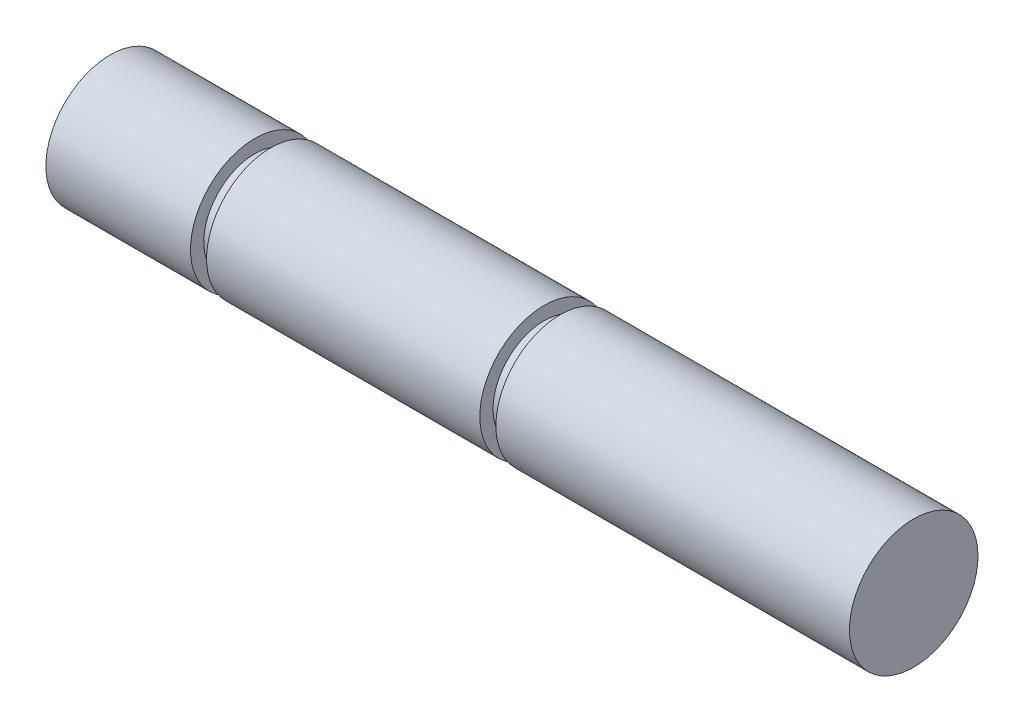
ISO-10303-21;
HEADER;
FILE_DESCRIPTION(('STEP AP214'),'2;1');
FILE_NAME('part.step','',(''),(''),'','','');
FILE_SCHEMA(('AUTOMOTIVE_DESIGN { 1 0 10303 214 1 1 1 1 }'));
ENDSEC;
DATA;
#1=APPLICATION_CONTEXT('core data for automotive mechanical design processes');
#2=APPLICATION_PROTOCOL_DEFINITION('international standard','automotive_design',2000,#1);
#3=PRODUCT_CONTEXT('',#1,'mechanical');
#4=PRODUCT('Part','Part','',(#3));
#5=PRODUCT_RELATED_PRODUCT_CATEGORY('part','',(#4));
#6=PRODUCT_DEFINITION_FORMATION('','',#4);
#7=PRODUCT_DEFINITION_CONTEXT('part definition',#1,'design');
#8=PRODUCT_DEFINITION('design','',#6,#7);
#9=PRODUCT_DEFINITION_SHAPE('','',#8);
#10=(LENGTH_UNIT() NAMED_UNIT(*) SI_UNIT(.MILLI.,.METRE.));
#11=(NAMED_UNIT(*) PLANE_ANGLE_UNIT() SI_UNIT($,.RADIAN.));
#12=(NAMED_UNIT(*) SI_UNIT($,.STERADIAN.) SOLID_ANGLE_UNIT());
#13=UNCERTAINTY_MEASURE_WITH_UNIT(LENGTH_MEASURE(1.E-05),#10,'distance_accuracy_value','');
#14=(GEOMETRIC_REPRESENTATION_CONTEXT(3) GLOBAL_UNCERTAINTY_ASSIGNED_CONTEXT((#13)) GLOBAL_UNIT_ASSIGNED_CONTEXT((#10,
#11,#12)) REPRESENTATION_CONTEXT('',''));
#15=CARTESIAN_POINT('',(0.,0.,0.));
#16=DIRECTION('',(0.,0.,1.));
#17=DIRECTION('',(1.,0.,0.));
#18=AXIS2_PLACEMENT_3D('',#15,#16,#17);
#19=CARTESIAN_POINT('',(0.,0.,0.));
#20=DIRECTION('',(1.,0.,0.));
#21=DIRECTION('',(0.,0.,-1.));
#22=AXIS2_PLACEMENT_3D('',#19,#20,#21);
#23=PLANE('',#22);
#24=CARTESIAN_POINT('',(0.,0.,0.));
#25=DIRECTION('',(1.,0.,0.));
#26=DIRECTION('',(0.,0.,-1.));
#27=AXIS2_PLACEMENT_3D('',#24,#25,#26);
#28=CIRCLE('',#27,4.);
#29=CARTESIAN_POINT('',(0.,0.,-4.));
#30=VERTEX_POINT('',#29);
#31=EDGE_CURVE('E20',#30,#30,#28,.T.);
#32=ORIENTED_EDGE('',*,*,#31,.F.);
#33=EDGE_LOOP('',(#32));
#34=FACE_BOUND('',#33,.T.);
#35=ADVANCED_FACE('F17',(#34),#23,.F.);
#36=CARTESIAN_POINT('',(50.002,0.,0.));
#37=DIRECTION('',(1.,0.,0.));
#38=DIRECTION('',(0.,0.,-1.));
#39=AXIS2_PLACEMENT_3D('',#36,#37,#38);
#40=CYLINDRICAL_SURFACE('',#39,4.);
#41=CARTESIAN_POINT('',(9.,0.,0.));
#42=DIRECTION('',(1.,0.,0.));
#43=DIRECTION('',(0.,0.,-1.));
#44=AXIS2_PLACEMENT_3D('',#41,#42,#43);
#45=CIRCLE('',#44,4.);
#46=CARTESIAN_POINT('',(9.,0.,-4.));
#47=VERTEX_POINT('',#46);
#48=EDGE_CURVE('E35',#47,#47,#45,.T.);
#49=ORIENTED_EDGE('',*,*,#48,.F.);
#50=EDGE_LOOP('',(#49));
#51=FACE_BOUND('',#50,.T.);
#52=ORIENTED_EDGE('',*,*,#31,.T.);
#53=EDGE_LOOP('',(#52));
#54=FACE_BOUND('',#53,.T.);
#55=ADVANCED_FACE('F87',(#51,#54),#40,.T.);
#56=CARTESIAN_POINT('',(9.,0.,4.));
#57=DIRECTION('',(1.,0.,0.));
#58=DIRECTION('',(0.,0.,-1.));
#59=AXIS2_PLACEMENT_3D('',#56,#57,#58);
#60=PLANE('',#59);
#61=ORIENTED_EDGE('',*,*,#48,.T.);
#62=EDGE_LOOP('',(#61));
#63=FACE_BOUND('',#62,.T.);
#64=CARTESIAN_POINT('',(9.,0.,0.));
#65=DIRECTION('',(1.,0.,0.));
#66=DIRECTION('',(0.,0.,-1.));
#67=AXIS2_PLACEMENT_3D('',#64,#65,#66);
#68=CIRCLE('',#67,3.175);
#69=CARTESIAN_POINT('',(9.,0.,-3.175));
#70=VERTEX_POINT('',#69);
#71=EDGE_CURVE('E83',#70,#70,#68,.T.);
#72=ORIENTED_EDGE('',*,*,#71,.F.);
#73=EDGE_LOOP('',(#72));
#74=FACE_BOUND('',#73,.T.);
#75=ADVANCED_FACE('F89',(#63,#74),#60,.T.);
#76=CARTESIAN_POINT('',(10.002,0.,0.));
#77=DIRECTION('',(1.,0.,0.));
#78=DIRECTION('',(0.,0.,-1.));
#79=AXIS2_PLACEMENT_3D('',#76,#77,#78);
#80=CYLINDRICAL_SURFACE('',#79,3.175);
#81=CARTESIAN_POINT('',(10.,0.,0.));
#82=DIRECTION('',(1.,0.,0.));
#83=DIRECTION('',(0.,0.,-1.));
#84=AXIS2_PLACEMENT_3D('',#81,#82,#83);
#85=CIRCLE('',#84,3.175);
#86=CARTESIAN_POINT('',(10.,0.,-3.175));
#87=VERTEX_POINT('',#86);
#88=EDGE_CURVE('E81',#87,#87,#85,.F.);
#89=ORIENTED_EDGE('',*,*,#88,.T.);
#90=EDGE_LOOP('',(#89));
#91=FACE_BOUND('',#90,.T.);
#92=ORIENTED_EDGE('',*,*,#71,.T.);
#93=EDGE_LOOP('',(#92));
#94=FACE_BOUND('',#93,.T.);
#95=ADVANCED_FACE('F95',(#91,#94),#80,.T.);
#96=CARTESIAN_POINT('',(10.,0.,11.));
#97=DIRECTION('',(1.,0.,0.));
#98=DIRECTION('',(0.,0.,-1.));
#99=AXIS2_PLACEMENT_3D('',#96,#97,#98);
#100=PLANE('',#99);
#101=ORIENTED_EDGE('',*,*,#88,.F.);
#102=EDGE_LOOP('',(#101));
#103=FACE_BOUND('',#102,.T.);
#104=CARTESIAN_POINT('',(10.,0.,0.));
#105=DIRECTION('',(1.,0.,0.));
#106=DIRECTION('',(0.,0.,-1.));
#107=AXIS2_PLACEMENT_3D('',#104,#105,#106);
#108=CIRCLE('',#107,4.);
#109=CARTESIAN_POINT('',(10.,0.,-4.));
#110=VERTEX_POINT('',#109);
#111=EDGE_CURVE('E78',#110,#110,#108,.T.);
#112=ORIENTED_EDGE('',*,*,#111,.F.);
#113=EDGE_LOOP('',(#112));
#114=FACE_BOUND('',#113,.T.);
#115=ADVANCED_FACE('F100',(#103,#114),#100,.F.);
#116=CARTESIAN_POINT('',(50.002,0.,0.));
#117=DIRECTION('',(1.,0.,0.));
#118=DIRECTION('',(0.,0.,-1.));
#119=AXIS2_PLACEMENT_3D('',#116,#117,#118);
#120=CYLINDRICAL_SURFACE('',#119,4.);
#121=CARTESIAN_POINT('',(27.,0.,0.));
#122=DIRECTION('',(1.,0.,0.));
#123=DIRECTION('',(0.,0.,-1.));
#124=AXIS2_PLACEMENT_3D('',#121,#122,#123);
#125=CIRCLE('',#124,4.);
#126=CARTESIAN_POINT('',(27.,0.,-4.));
#127=VERTEX_POINT('',#126);
#128=EDGE_CURVE('E75',#127,#127,#125,.T.);
#129=ORIENTED_EDGE('',*,*,#128,.F.);
#130=EDGE_LOOP('',(#129));
#131=FACE_BOUND('',#130,.T.);
#132=ORIENTED_EDGE('',*,*,#111,.T.);
#133=EDGE_LOOP('',(#132));
#134=FACE_BOUND('',#133,.T.);
#135=ADVANCED_FACE('F104',(#131,#134),#120,.T.);
#136=CARTESIAN_POINT('',(27.,0.,11.));
#137=DIRECTION('',(1.,0.,0.));
#138=DIRECTION('',(0.,0.,-1.));
#139=AXIS2_PLACEMENT_3D('',#136,#137,#138);
#140=PLANE('',#139);
#141=ORIENTED_EDGE('',*,*,#128,.T.);
#142=EDGE_LOOP('',(#141));
#143=FACE_BOUND('',#142,.T.);
#144=CARTESIAN_POINT('',(27.,0.,0.));
#145=DIRECTION('',(1.,0.,0.));
#146=DIRECTION('',(0.,0.,-1.));
#147=AXIS2_PLACEMENT_3D('',#144,#145,#146);
#148=CIRCLE('',#147,3.175);
#149=CARTESIAN_POINT('',(27.,0.,-3.175));
#150=VERTEX_POINT('',#149);
#151=EDGE_CURVE('E70',#150,#150,#148,.T.);
#152=ORIENTED_EDGE('',*,*,#151,.F.);
#153=EDGE_LOOP('',(#152));
#154=FACE_BOUND('',#153,.T.);
#155=ADVANCED_FACE('F108',(#143,#154),#140,.T.);
#156=CARTESIAN_POINT('',(28.002,0.,0.));
#157=DIRECTION('',(1.,0.,0.));
#158=DIRECTION('',(0.,0.,-1.));
#159=AXIS2_PLACEMENT_3D('',#156,#157,#158);
#160=CYLINDRICAL_SURFACE('',#159,3.175);
#161=CARTESIAN_POINT('',(28.,0.,0.));
#162=DIRECTION('',(1.,0.,0.));
#163=DIRECTION('',(0.,0.,-1.));
#164=AXIS2_PLACEMENT_3D('',#161,#162,#163);
#165=CIRCLE('',#164,3.175);
#166=CARTESIAN_POINT('',(28.,0.,-3.175));
#167=VERTEX_POINT('',#166);
#168=EDGE_CURVE('E68',#167,#167,#165,.F.);
#169=ORIENTED_EDGE('',*,*,#168,.T.);
#170=EDGE_LOOP('',(#169));
#171=FACE_BOUND('',#170,.T.);
#172=ORIENTED_EDGE('',*,*,#151,.T.);
#173=EDGE_LOOP('',(#172));
#174=FACE_BOUND('',#173,.T.);
#175=ADVANCED_FACE('F112',(#171,#174),#160,.T.);
#176=CARTESIAN_POINT('',(28.,0.,4.));
#177=DIRECTION('',(1.,0.,0.));
#178=DIRECTION('',(0.,0.,-1.));
#179=AXIS2_PLACEMENT_3D('',#176,#177,#178);
#180=PLANE('',#179);
#181=ORIENTED_EDGE('',*,*,#168,.F.);
#182=EDGE_LOOP('',(#181));
#183=FACE_BOUND('',#182,.T.);
#184=CARTESIAN_POINT('',(28.,0.,0.));
#185=DIRECTION('',(1.,0.,0.));
#186=DIRECTION('',(0.,0.,-1.));
#187=AXIS2_PLACEMENT_3D('',#184,#185,#186);
#188=CIRCLE('',#187,4.);
#189=CARTESIAN_POINT('',(28.,0.,-4.));
#190=VERTEX_POINT('',#189);
#191=EDGE_CURVE('E25',#190,#190,#188,.T.);
#192=ORIENTED_EDGE('',*,*,#191,.F.);
#193=EDGE_LOOP('',(#192));
#194=FACE_BOUND('',#193,.T.);
#195=ADVANCED_FACE('F116',(#183,#194),#180,.F.);
#196=CARTESIAN_POINT('',(50.,0.,4.));
#197=DIRECTION('',(1.,0.,0.));
#198=DIRECTION('',(0.,0.,-1.));
#199=AXIS2_PLACEMENT_3D('',#196,#197,#198);
#200=PLANE('',#199);
#201=CARTESIAN_POINT('',(50.,0.,0.));
#202=DIRECTION('',(1.,0.,0.));
#203=DIRECTION('',(0.,0.,-1.));
#204=AXIS2_PLACEMENT_3D('',#201,#202,#203);
#205=CIRCLE('',#204,4.);
#206=CARTESIAN_POINT('',(50.,0.,-4.));
#207=VERTEX_POINT('',#206);
#208=EDGE_CURVE('E11',#207,#207,#205,.F.);
#209=ORIENTED_EDGE('',*,*,#208,.F.);
#210=EDGE_LOOP('',(#209));
#211=FACE_BOUND('',#210,.T.);
#212=ADVANCED_FACE('F60',(#211),#200,.T.);
#213=CARTESIAN_POINT('',(50.002,0.,0.));
#214=DIRECTION('',(1.,0.,0.));
#215=DIRECTION('',(0.,0.,-1.));
#216=AXIS2_PLACEMENT_3D('',#213,#214,#215);
#217=CYLINDRICAL_SURFACE('',#216,4.);
#218=ORIENTED_EDGE('',*,*,#208,.T.);
#219=EDGE_LOOP('',(#218));
#220=FACE_BOUND('',#219,.T.);
#221=ORIENTED_EDGE('',*,*,#191,.T.);
#222=EDGE_LOOP('',(#221));
#223=FACE_BOUND('',#222,.T.);
#224=ADVANCED_FACE('F62',(#220,#223),#217,.T.);
#225=CLOSED_SHELL('',(#35,#55,#75,#95,#115,#135,#155,#175,#195,#212,#224));
#226=MANIFOLD_SOLID_BREP('B1',#225);
#227=ADVANCED_BREP_SHAPE_REPRESENTATION('',(#18,#226),#14);
#228=SHAPE_DEFINITION_REPRESENTATION(#9,#227);
ENDSEC;
END-ISO-10303-21;
